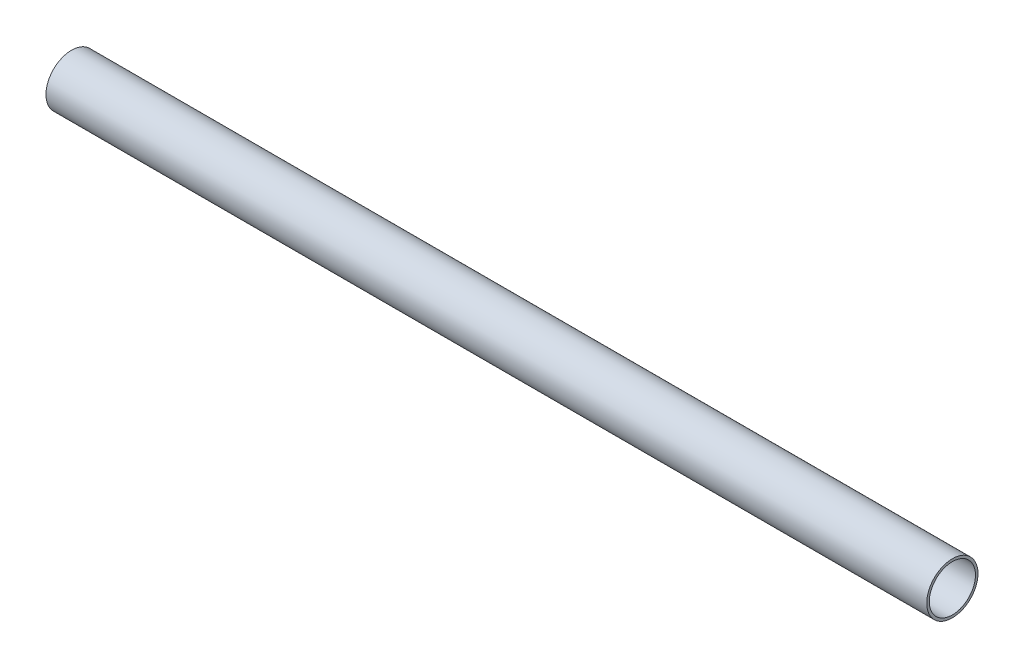
ISO-10303-21;
HEADER;
FILE_DESCRIPTION(('STEP AP214'),'2;1');
FILE_NAME('part.step','',(''),(''),'','','');
FILE_SCHEMA(('AUTOMOTIVE_DESIGN { 1 0 10303 214 1 1 1 1 }'));
ENDSEC;
DATA;
#1=APPLICATION_CONTEXT('core data for automotive mechanical design processes');
#2=APPLICATION_PROTOCOL_DEFINITION('international standard','automotive_design',2000,#1);
#3=PRODUCT_CONTEXT('',#1,'mechanical');
#4=PRODUCT('Part','Part','',(#3));
#5=PRODUCT_RELATED_PRODUCT_CATEGORY('part','',(#4));
#6=PRODUCT_DEFINITION_FORMATION('','',#4);
#7=PRODUCT_DEFINITION_CONTEXT('part definition',#1,'design');
#8=PRODUCT_DEFINITION('design','',#6,#7);
#9=PRODUCT_DEFINITION_SHAPE('','',#8);
#10=(LENGTH_UNIT() NAMED_UNIT(*) SI_UNIT(.MILLI.,.METRE.));
#11=(NAMED_UNIT(*) PLANE_ANGLE_UNIT() SI_UNIT($,.RADIAN.));
#12=(NAMED_UNIT(*) SI_UNIT($,.STERADIAN.) SOLID_ANGLE_UNIT());
#13=UNCERTAINTY_MEASURE_WITH_UNIT(LENGTH_MEASURE(1.E-05),#10,'distance_accuracy_value','');
#14=(GEOMETRIC_REPRESENTATION_CONTEXT(3) GLOBAL_UNCERTAINTY_ASSIGNED_CONTEXT((#13)) GLOBAL_UNIT_ASSIGNED_CONTEXT((#10,
#11,#12)) REPRESENTATION_CONTEXT('',''));
#15=CARTESIAN_POINT('',(0.,0.,0.));
#16=DIRECTION('',(0.,0.,1.));
#17=DIRECTION('',(1.,0.,0.));
#18=AXIS2_PLACEMENT_3D('',#15,#16,#17);
#19=CARTESIAN_POINT('',(1036.,0.,0.));
#20=DIRECTION('',(1.,0.,0.));
#21=DIRECTION('',(0.,0.,-1.));
#22=AXIS2_PLACEMENT_3D('',#19,#20,#21);
#23=PLANE('',#22);
#24=CARTESIAN_POINT('',(1036.,0.,0.));
#25=DIRECTION('',(1.,0.,0.));
#26=DIRECTION('',(0.,0.,-1.));
#27=AXIS2_PLACEMENT_3D('',#24,#25,#26);
#28=CIRCLE('',#27,30.15);
#29=CARTESIAN_POINT('',(1036.,0.,-30.15));
#30=VERTEX_POINT('',#29);
#31=EDGE_CURVE('E10',#30,#30,#28,.T.);
#32=ORIENTED_EDGE('',*,*,#31,.T.);
#33=EDGE_LOOP('',(#32));
#34=FACE_BOUND('',#33,.T.);
#35=CARTESIAN_POINT('',(1036.,0.,0.));
#36=DIRECTION('',(1.,0.,0.));
#37=DIRECTION('',(0.,0.,-1.));
#38=AXIS2_PLACEMENT_3D('',#35,#36,#37);
#39=CIRCLE('',#38,27.15);
#40=CARTESIAN_POINT('',(1036.,0.,-27.15));
#41=VERTEX_POINT('',#40);
#42=EDGE_CURVE('E42',#41,#41,#39,.T.);
#43=ORIENTED_EDGE('',*,*,#42,.F.);
#44=EDGE_LOOP('',(#43));
#45=FACE_BOUND('',#44,.T.);
#46=ADVANCED_FACE('F31',(#34,#45),#23,.T.);
#47=CARTESIAN_POINT('',(0.,0.,0.));
#48=DIRECTION('',(1.,0.,0.));
#49=DIRECTION('',(0.,0.,-1.));
#50=AXIS2_PLACEMENT_3D('',#47,#48,#49);
#51=PLANE('',#50);
#52=CARTESIAN_POINT('',(0.,0.,0.));
#53=DIRECTION('',(1.,0.,0.));
#54=DIRECTION('',(0.,0.,-1.));
#55=AXIS2_PLACEMENT_3D('',#52,#53,#54);
#56=CIRCLE('',#55,30.15);
#57=CARTESIAN_POINT('',(0.,0.,-30.15));
#58=VERTEX_POINT('',#57);
#59=EDGE_CURVE('E35',#58,#58,#56,.T.);
#60=ORIENTED_EDGE('',*,*,#59,.F.);
#61=EDGE_LOOP('',(#60));
#62=FACE_BOUND('',#61,.T.);
#63=CARTESIAN_POINT('',(0.,0.,0.));
#64=DIRECTION('',(1.,0.,0.));
#65=DIRECTION('',(0.,0.,-1.));
#66=AXIS2_PLACEMENT_3D('',#63,#64,#65);
#67=CIRCLE('',#66,27.15);
#68=CARTESIAN_POINT('',(0.,0.,-27.15));
#69=VERTEX_POINT('',#68);
#70=EDGE_CURVE('E44',#69,#69,#67,.T.);
#71=ORIENTED_EDGE('',*,*,#70,.T.);
#72=EDGE_LOOP('',(#71));
#73=FACE_BOUND('',#72,.T.);
#74=ADVANCED_FACE('F54',(#62,#73),#51,.F.);
#75=CARTESIAN_POINT('',(1036.,0.,0.));
#76=DIRECTION('',(-1.,0.,0.));
#77=DIRECTION('',(0.,0.,1.));
#78=AXIS2_PLACEMENT_3D('',#75,#76,#77);
#79=CYLINDRICAL_SURFACE('',#78,30.15);
#80=ORIENTED_EDGE('',*,*,#31,.F.);
#81=EDGE_LOOP('',(#80));
#82=FACE_BOUND('',#81,.T.);
#83=ORIENTED_EDGE('',*,*,#59,.T.);
#84=EDGE_LOOP('',(#83));
#85=FACE_BOUND('',#84,.T.);
#86=ADVANCED_FACE('F33',(#82,#85),#79,.T.);
#87=CARTESIAN_POINT('',(1036.,0.,0.));
#88=DIRECTION('',(-1.,0.,0.));
#89=DIRECTION('',(0.,0.,1.));
#90=AXIS2_PLACEMENT_3D('',#87,#88,#89);
#91=CYLINDRICAL_SURFACE('',#90,27.15);
#92=ORIENTED_EDGE('',*,*,#42,.T.);
#93=EDGE_LOOP('',(#92));
#94=FACE_BOUND('',#93,.T.);
#95=ORIENTED_EDGE('',*,*,#70,.F.);
#96=EDGE_LOOP('',(#95));
#97=FACE_BOUND('',#96,.T.);
#98=ADVANCED_FACE('F50',(#94,#97),#91,.F.);
#99=CLOSED_SHELL('',(#46,#74,#86,#98));
#100=MANIFOLD_SOLID_BREP('B2',#99);
#101=ADVANCED_BREP_SHAPE_REPRESENTATION('',(#18,#100),#14);
#102=SHAPE_DEFINITION_REPRESENTATION(#9,#101);
ENDSEC;
END-ISO-10303-21;
